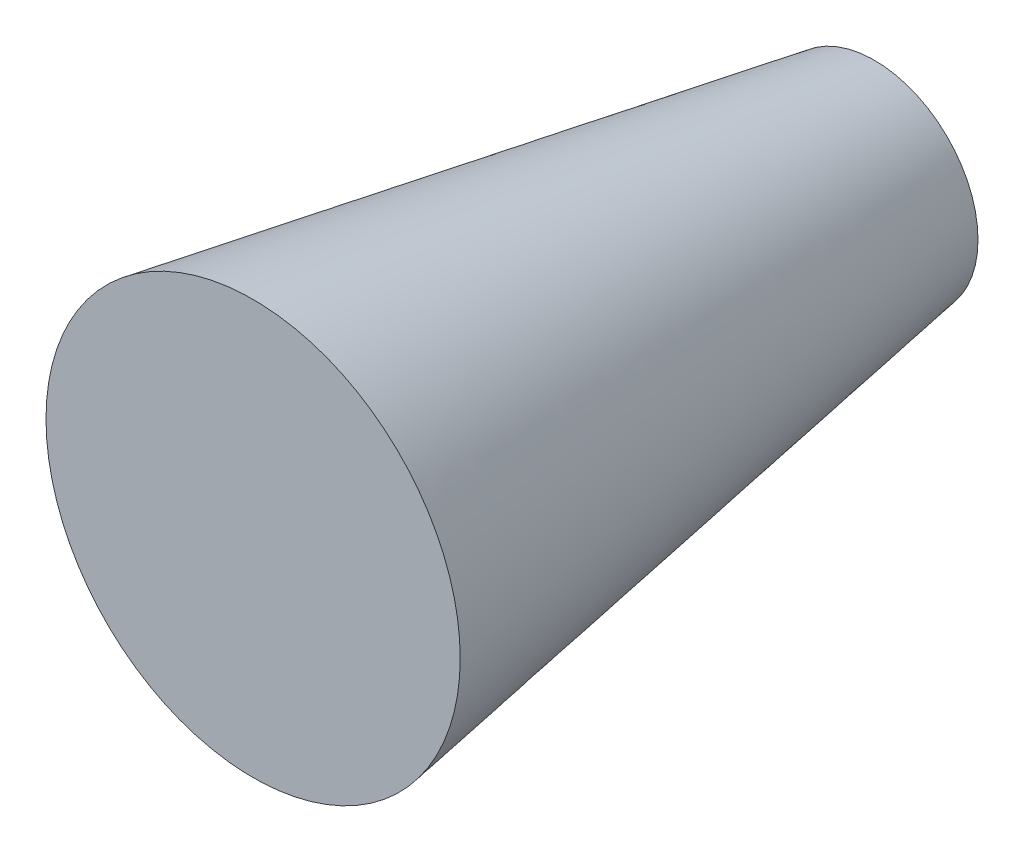
ISO-10303-21;
HEADER;
FILE_DESCRIPTION(('STEP AP214'),'2;1');
FILE_NAME('part.step','',(''),(''),'','','');
FILE_SCHEMA(('AUTOMOTIVE_DESIGN { 1 0 10303 214 1 1 1 1 }'));
ENDSEC;
DATA;
#1=APPLICATION_CONTEXT('core data for automotive mechanical design processes');
#2=APPLICATION_PROTOCOL_DEFINITION('international standard','automotive_design',2000,#1);
#3=PRODUCT_CONTEXT('',#1,'mechanical');
#4=PRODUCT('Part','Part','',(#3));
#5=PRODUCT_RELATED_PRODUCT_CATEGORY('part','',(#4));
#6=PRODUCT_DEFINITION_FORMATION('','',#4);
#7=PRODUCT_DEFINITION_CONTEXT('part definition',#1,'design');
#8=PRODUCT_DEFINITION('design','',#6,#7);
#9=PRODUCT_DEFINITION_SHAPE('','',#8);
#10=(LENGTH_UNIT() NAMED_UNIT(*) SI_UNIT(.MILLI.,.METRE.));
#11=(NAMED_UNIT(*) PLANE_ANGLE_UNIT() SI_UNIT($,.RADIAN.));
#12=(NAMED_UNIT(*) SI_UNIT($,.STERADIAN.) SOLID_ANGLE_UNIT());
#13=UNCERTAINTY_MEASURE_WITH_UNIT(LENGTH_MEASURE(1.E-05),#10,'distance_accuracy_value','');
#14=(GEOMETRIC_REPRESENTATION_CONTEXT(3) GLOBAL_UNCERTAINTY_ASSIGNED_CONTEXT((#13)) GLOBAL_UNIT_ASSIGNED_CONTEXT((#10,
#11,#12)) REPRESENTATION_CONTEXT('',''));
#15=CARTESIAN_POINT('',(0.,0.,0.));
#16=DIRECTION('',(0.,0.,1.));
#17=DIRECTION('',(1.,0.,0.));
#18=AXIS2_PLACEMENT_3D('',#15,#16,#17);
#19=CARTESIAN_POINT('',(0.,0.,30.));
#20=DIRECTION('',(0.,0.,1.));
#21=DIRECTION('',(1.,0.,0.));
#22=AXIS2_PLACEMENT_3D('',#19,#20,#21);
#23=PLANE('',#22);
#24=CARTESIAN_POINT('',(0.,0.,30.));
#25=DIRECTION('',(0.,0.,1.));
#26=DIRECTION('',(1.,0.,0.));
#27=AXIS2_PLACEMENT_3D('',#24,#25,#26);
#28=CIRCLE('',#27,10.);
#29=CARTESIAN_POINT('',(10.,0.,30.));
#30=VERTEX_POINT('',#29);
#31=EDGE_CURVE('E12',#30,#30,#28,.T.);
#32=ORIENTED_EDGE('',*,*,#31,.T.);
#33=EDGE_LOOP('',(#32));
#34=FACE_BOUND('',#33,.T.);
#35=ADVANCED_FACE('F64',(#34),#23,.T.);
#36=CARTESIAN_POINT('',(0.,0.,0.));
#37=DIRECTION('',(0.,0.,1.));
#38=DIRECTION('',(1.,0.,0.));
#39=AXIS2_PLACEMENT_3D('',#36,#37,#38);
#40=PLANE('',#39);
#41=CARTESIAN_POINT('',(0.,0.,0.));
#42=DIRECTION('',(0.,0.,1.));
#43=DIRECTION('',(1.,0.,0.));
#44=AXIS2_PLACEMENT_3D('',#41,#42,#43);
#45=CIRCLE('',#44,5.);
#46=CARTESIAN_POINT('',(5.,0.,0.));
#47=VERTEX_POINT('',#46);
#48=EDGE_CURVE('E67',#47,#47,#45,.T.);
#49=ORIENTED_EDGE('',*,*,#48,.F.);
#50=EDGE_LOOP('',(#49));
#51=FACE_BOUND('',#50,.T.);
#52=ADVANCED_FACE('F91',(#51),#40,.F.);
#53=CARTESIAN_POINT('',(5.,0.,0.));
#54=CARTESIAN_POINT('',(6.66666666666667,0.,10.));
#55=CARTESIAN_POINT('',(8.33333333333333,0.,20.));
#56=CARTESIAN_POINT('',(10.,0.,30.));
#57=CARTESIAN_POINT('',(5.,0.137978752480774,0.));
#58=CARTESIAN_POINT('',(6.66666666666667,0.183971669974365,10.));
#59=CARTESIAN_POINT('',(8.33333333333333,0.229964587467957,20.));
#60=CARTESIAN_POINT('',(10.,0.275957504961548,30.));
#61=CARTESIAN_POINT('',(4.98879787524808,0.411340506946168,0.));
#62=CARTESIAN_POINT('',(6.65173050033077,0.548454009261557,10.));
#63=CARTESIAN_POINT('',(8.31466312541346,0.685567511576947,20.));
#64=CARTESIAN_POINT('',(9.97759575049615,0.822681013892336,30.));
#65=CARTESIAN_POINT('',(4.93967927000279,0.812304931017432,0.));
#66=CARTESIAN_POINT('',(6.58623902667039,1.08307324135658,10.));
#67=CARTESIAN_POINT('',(8.23279878333799,1.35384155169572,20.));
#68=CARTESIAN_POINT('',(9.87935854000558,1.62460986203486,30.));
#69=CARTESIAN_POINT('',(4.85953620277847,1.2029001913235,0.));
#70=CARTESIAN_POINT('',(6.47938160370462,1.60386692176467,10.));
#71=CARTESIAN_POINT('',(8.09922700463078,2.00483365220583,20.));
#72=CARTESIAN_POINT('',(9.71907240555694,2.405800382647,30.));
#73=CARTESIAN_POINT('',(4.20027676438849,3.47651103373854,0.));
#74=CARTESIAN_POINT('',(5.60036901918466,4.63534804498472,10.));
#75=CARTESIAN_POINT('',(7.00046127398082,5.7941850562309,20.));
#76=CARTESIAN_POINT('',(8.40055352877699,6.95302206747708,30.));
#77=CARTESIAN_POINT('',(2.2076600396924,5.,0.));
#78=CARTESIAN_POINT('',(2.94354671958987,6.66666666666667,10.));
#79=CARTESIAN_POINT('',(3.67943339948733,8.33333333333333,20.));
#80=CARTESIAN_POINT('',(4.4153200793848,10.,30.));
#81=CARTESIAN_POINT('',(-2.7595750496155,5.,0.));
#82=CARTESIAN_POINT('',(-3.67943339948733,6.66666666666667,10.));
#83=CARTESIAN_POINT('',(-4.59929174935917,8.33333333333333,20.));
#84=CARTESIAN_POINT('',(-5.519150099231,10.,30.));
#85=CARTESIAN_POINT('',(-5.,2.7595750496155,0.));
#86=CARTESIAN_POINT('',(-6.66666666666667,3.67943339948733,10.));
#87=CARTESIAN_POINT('',(-8.33333333333333,4.59929174935917,20.));
#88=CARTESIAN_POINT('',(-10.,5.519150099231,30.));
#89=CARTESIAN_POINT('',(-5.,-2.7595750496155,0.));
#90=CARTESIAN_POINT('',(-6.66666666666667,-3.67943339948733,10.));
#91=CARTESIAN_POINT('',(-8.33333333333333,-4.59929174935917,20.));
#92=CARTESIAN_POINT('',(-10.,-5.519150099231,30.));
#93=CARTESIAN_POINT('',(-2.7595750496155,-5.,0.));
#94=CARTESIAN_POINT('',(-3.67943339948733,-6.66666666666667,10.));
#95=CARTESIAN_POINT('',(-4.59929174935917,-8.33333333333333,20.));
#96=CARTESIAN_POINT('',(-5.519150099231,-10.,30.));
#97=CARTESIAN_POINT('',(2.2076600396924,-5.,0.));
#98=CARTESIAN_POINT('',(2.94354671958987,-6.66666666666667,10.));
#99=CARTESIAN_POINT('',(3.67943339948733,-8.33333333333334,20.));
#100=CARTESIAN_POINT('',(4.4153200793848,-10.,30.));
#101=CARTESIAN_POINT('',(4.20027676438849,-3.47651103373854,0.));
#102=CARTESIAN_POINT('',(5.60036901918466,-4.63534804498472,10.));
#103=CARTESIAN_POINT('',(7.00046127398082,-5.7941850562309,20.));
#104=CARTESIAN_POINT('',(8.40055352877699,-6.95302206747708,30.));
#105=CARTESIAN_POINT('',(4.85953620277847,-1.2029001913235,0.));
#106=CARTESIAN_POINT('',(6.47938160370462,-1.60386692176467,10.));
#107=CARTESIAN_POINT('',(8.09922700463078,-2.00483365220583,20.));
#108=CARTESIAN_POINT('',(9.71907240555693,-2.405800382647,30.));
#109=CARTESIAN_POINT('',(4.93967927000279,-0.812304931017433,0.));
#110=CARTESIAN_POINT('',(6.58623902667039,-1.08307324135658,10.));
#111=CARTESIAN_POINT('',(8.23279878333798,-1.35384155169572,20.));
#112=CARTESIAN_POINT('',(9.87935854000558,-1.62460986203487,30.));
#113=CARTESIAN_POINT('',(4.98879787524808,-0.411340506946171,0.));
#114=CARTESIAN_POINT('',(6.65173050033077,-0.548454009261561,10.));
#115=CARTESIAN_POINT('',(8.31466312541346,-0.685567511576951,20.));
#116=CARTESIAN_POINT('',(9.97759575049615,-0.822681013892341,30.));
#117=CARTESIAN_POINT('',(5.,-0.137978752480775,0.));
#118=CARTESIAN_POINT('',(6.66666666666667,-0.183971669974367,10.));
#119=CARTESIAN_POINT('',(8.33333333333333,-0.229964587467959,20.));
#120=CARTESIAN_POINT('',(10.,-0.27595750496155,30.));
#121=CARTESIAN_POINT('',(5.,0.,0.));
#122=CARTESIAN_POINT('',(6.66666666666667,0.,10.));
#123=CARTESIAN_POINT('',(8.33333333333333,0.,20.));
#124=CARTESIAN_POINT('',(10.,0.,30.));
#125=B_SPLINE_SURFACE_WITH_KNOTS('',3,3,((#53,#54,#55,#56),(#57,#58,#59,#60),(#61,#62,#63,#64),
(#65,#66,#67,#68),(#69,#70,#71,#72),(#73,#74,#75,#76),(#77,#78,#79,#80),(#81,#82,#83,#84),(#85,
#86,#87,#88),(#89,#90,#91,#92),(#93,#94,#95,#96),(#97,#98,#99,#100),(#101,#102,#103,#104),(#105,
#106,#107,#108),(#109,#110,#111,#112),(#113,#114,#115,#116),(#117,#118,#119,#120),(#121,#122,
#123,#124)),.UNSPECIFIED.,.T.,.F.,.F.,(4,1,1,1,1,2,2,2,1,1,1,1,4),(4,4),(0.,0.0125,
0.0249999999999999,0.0375000000000001,0.05,0.25,0.5,0.75,0.95,0.9625,0.975,0.9875,1.),(0.,1.),.UNSPECIFIED.);
#126=CARTESIAN_POINT('',(5.,0.,0.));
#127=CARTESIAN_POINT('',(5.05208333333333,0.,0.3125));
#128=CARTESIAN_POINT('',(5.10416666666667,0.,0.625));
#129=CARTESIAN_POINT('',(5.20833333333333,0.,1.25));
#130=CARTESIAN_POINT('',(5.26041666666667,0.,1.5625));
#131=CARTESIAN_POINT('',(5.36458333333333,0.,2.1875));
#132=CARTESIAN_POINT('',(5.41666666666667,0.,2.5));
#133=CARTESIAN_POINT('',(5.52083333333333,0.,3.125));
#134=CARTESIAN_POINT('',(5.57291666666667,0.,3.4375));
#135=CARTESIAN_POINT('',(5.67708333333333,0.,4.0625));
#136=CARTESIAN_POINT('',(5.72916666666667,0.,4.375));
#137=CARTESIAN_POINT('',(5.83333333333333,0.,5.));
#138=CARTESIAN_POINT('',(5.88541666666667,0.,5.3125));
#139=CARTESIAN_POINT('',(5.98958333333333,0.,5.9375));
#140=CARTESIAN_POINT('',(6.04166666666667,0.,6.25));
#141=CARTESIAN_POINT('',(6.14583333333333,0.,6.875));
#142=CARTESIAN_POINT('',(6.19791666666667,0.,7.1875));
#143=CARTESIAN_POINT('',(6.30208333333333,0.,7.8125));
#144=CARTESIAN_POINT('',(6.35416666666667,0.,8.125));
#145=CARTESIAN_POINT('',(6.45833333333333,0.,8.75));
#146=CARTESIAN_POINT('',(6.51041666666667,0.,9.0625));
#147=CARTESIAN_POINT('',(6.61458333333333,0.,9.6875));
#148=CARTESIAN_POINT('',(6.66666666666667,0.,10.));
#149=CARTESIAN_POINT('',(6.77083333333333,0.,10.625));
#150=CARTESIAN_POINT('',(6.82291666666667,0.,10.9375));
#151=CARTESIAN_POINT('',(6.92708333333333,0.,11.5625));
#152=CARTESIAN_POINT('',(6.97916666666667,0.,11.875));
#153=CARTESIAN_POINT('',(7.08333333333333,0.,12.5));
#154=CARTESIAN_POINT('',(7.13541666666667,0.,12.8125));
#155=CARTESIAN_POINT('',(7.23958333333333,0.,13.4375));
#156=CARTESIAN_POINT('',(7.29166666666667,0.,13.75));
#157=CARTESIAN_POINT('',(7.39583333333333,0.,14.375));
#158=CARTESIAN_POINT('',(7.44791666666667,0.,14.6875));
#159=CARTESIAN_POINT('',(7.55208333333333,0.,15.3125));
#160=CARTESIAN_POINT('',(7.60416666666666,0.,15.625));
#161=CARTESIAN_POINT('',(7.70833333333333,0.,16.25));
#162=CARTESIAN_POINT('',(7.76041666666667,0.,16.5625));
#163=CARTESIAN_POINT('',(7.86458333333333,0.,17.1875));
#164=CARTESIAN_POINT('',(7.91666666666667,0.,17.5));
#165=CARTESIAN_POINT('',(8.02083333333333,0.,18.125));
#166=CARTESIAN_POINT('',(8.07291666666666,0.,18.4375));
#167=CARTESIAN_POINT('',(8.17708333333333,0.,19.0625));
#168=CARTESIAN_POINT('',(8.22916666666667,0.,19.375));
#169=CARTESIAN_POINT('',(8.33333333333334,0.,20.));
#170=CARTESIAN_POINT('',(8.38541666666667,0.,20.3125));
#171=CARTESIAN_POINT('',(8.48958333333333,0.,20.9375));
#172=CARTESIAN_POINT('',(8.54166666666666,0.,21.25));
#173=CARTESIAN_POINT('',(8.64583333333333,0.,21.875));
#174=CARTESIAN_POINT('',(8.69791666666666,0.,22.1875));
#175=CARTESIAN_POINT('',(8.80208333333333,0.,22.8125));
#176=CARTESIAN_POINT('',(8.85416666666667,0.,23.125));
#177=CARTESIAN_POINT('',(8.95833333333333,0.,23.75));
#178=CARTESIAN_POINT('',(9.01041666666666,0.,24.0625));
#179=CARTESIAN_POINT('',(9.11458333333333,0.,24.6875));
#180=CARTESIAN_POINT('',(9.16666666666667,0.,25.));
#181=CARTESIAN_POINT('',(9.27083333333333,0.,25.625));
#182=CARTESIAN_POINT('',(9.32291666666666,0.,25.9375));
#183=CARTESIAN_POINT('',(9.42708333333333,0.,26.5625));
#184=CARTESIAN_POINT('',(9.47916666666667,0.,26.875));
#185=CARTESIAN_POINT('',(9.58333333333333,0.,27.5));
#186=CARTESIAN_POINT('',(9.63541666666667,0.,27.8125));
#187=CARTESIAN_POINT('',(9.73958333333333,0.,28.4375));
#188=CARTESIAN_POINT('',(9.79166666666667,0.,28.75));
#189=CARTESIAN_POINT('',(9.89583333333333,0.,29.375));
#190=CARTESIAN_POINT('',(9.94791666666667,0.,29.6875));
#191=CARTESIAN_POINT('',(10.,0.,30.));
#192=B_SPLINE_CURVE_WITH_KNOTS('',3,(#126,#127,#128,#129,#130,#131,#132,#133,#134,#135,#136,
#137,#138,#139,#140,#141,#142,#143,#144,#145,#146,#147,#148,#149,#150,#151,#152,#153,#154,#155,
#156,#157,#158,#159,#160,#161,#162,#163,#164,#165,#166,#167,#168,#169,#170,#171,#172,#173,#174,
#175,#176,#177,#178,#179,#180,#181,#182,#183,#184,#185,#186,#187,#188,#189,#190,#191),
.UNSPECIFIED.,.F.,.F.,(4,2,2,2,2,2,2,2,2,2,2,2,2,2,2,2,2,2,2,2,2,2,2,2,2,2,2,2,2,2,2,2,4),(0.,
0.950431645359097,1.90086329071819,2.85129493607729,3.80172658143639,4.75215822679549,
5.70258987215458,6.65302151751368,7.60345316287277,8.55388480823187,9.50431645359097,
10.4547480989501,11.4051797443092,12.3556113896683,13.3060430350274,14.2564746803865,
15.2069063257455,16.1573379711046,17.1077696164637,18.0582012618228,19.0086329071819,
19.959064552541,20.9094961979001,21.8599278432592,22.8103594886183,23.7607911339774,
24.7112227793365,25.6616544246956,26.6120860700547,27.5625177154138,28.5129493607729,
29.463381006132,30.4138126514911),.UNSPECIFIED.);
#193=EDGE_CURVE('BSEAM101',#47,#30,#192,.T.);
#194=ORIENTED_EDGE('',*,*,#48,.T.);
#195=ORIENTED_EDGE('',*,*,#31,.F.);
#196=ORIENTED_EDGE('',*,*,#193,.T.);
#197=ORIENTED_EDGE('',*,*,#193,.F.);
#198=EDGE_LOOP('',(#194,#196,#195,#197));
#199=FACE_BOUND('',#198,.T.);
#200=ADVANCED_FACE('F101',(#199),#125,.T.);
#201=CLOSED_SHELL('',(#35,#52,#200));
#202=MANIFOLD_SOLID_BREP('B2',#201);
#203=ADVANCED_BREP_SHAPE_REPRESENTATION('',(#18,#202),#14);
#204=SHAPE_DEFINITION_REPRESENTATION(#9,#203);
ENDSEC;
END-ISO-10303-21;
